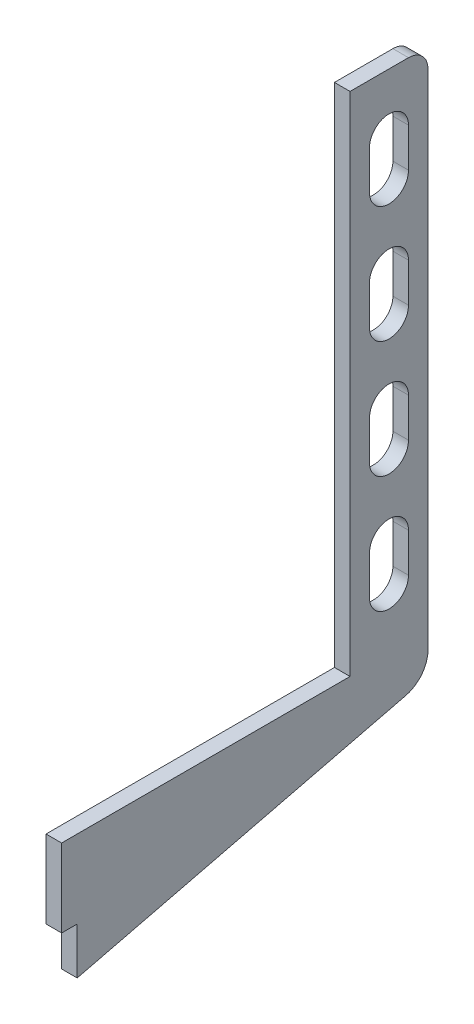
ISO-10303-21;
HEADER;
FILE_DESCRIPTION(('STEP AP214'),'2;1');
FILE_NAME('part.step','',(''),(''),'','','');
FILE_SCHEMA(('AUTOMOTIVE_DESIGN { 1 0 10303 214 1 1 1 1 }'));
ENDSEC;
DATA;
#1=APPLICATION_CONTEXT('core data for automotive mechanical design processes');
#2=APPLICATION_PROTOCOL_DEFINITION('international standard','automotive_design',2000,#1);
#3=PRODUCT_CONTEXT('',#1,'mechanical');
#4=PRODUCT('Part','Part','',(#3));
#5=PRODUCT_RELATED_PRODUCT_CATEGORY('part','',(#4));
#6=PRODUCT_DEFINITION_FORMATION('','',#4);
#7=PRODUCT_DEFINITION_CONTEXT('part definition',#1,'design');
#8=PRODUCT_DEFINITION('design','',#6,#7);
#9=PRODUCT_DEFINITION_SHAPE('','',#8);
#10=(LENGTH_UNIT() NAMED_UNIT(*) SI_UNIT(.MILLI.,.METRE.));
#11=(NAMED_UNIT(*) PLANE_ANGLE_UNIT() SI_UNIT($,.RADIAN.));
#12=(NAMED_UNIT(*) SI_UNIT($,.STERADIAN.) SOLID_ANGLE_UNIT());
#13=UNCERTAINTY_MEASURE_WITH_UNIT(LENGTH_MEASURE(1.E-05),#10,'distance_accuracy_value','');
#14=(GEOMETRIC_REPRESENTATION_CONTEXT(3) GLOBAL_UNCERTAINTY_ASSIGNED_CONTEXT((#13)) GLOBAL_UNIT_ASSIGNED_CONTEXT((#10,
#11,#12)) REPRESENTATION_CONTEXT('',''));
#15=CARTESIAN_POINT('',(0.,0.,0.));
#16=DIRECTION('',(0.,0.,1.));
#17=DIRECTION('',(1.,0.,0.));
#18=AXIS2_PLACEMENT_3D('',#15,#16,#17);
#19=CARTESIAN_POINT('',(0.,175.26,-119.38));
#20=DIRECTION('',(1.,0.,0.));
#21=DIRECTION('',(0.,1.,0.));
#22=AXIS2_PLACEMENT_3D('',#19,#20,#21);
#23=PLANE('',#22);
#24=CARTESIAN_POINT('',(0.,342.9,-213.36));
#25=DIRECTION('',(-1.,0.,0.));
#26=DIRECTION('',(0.,-1.,0.));
#27=AXIS2_PLACEMENT_3D('',#24,#25,#26);
#28=CIRCLE('',#27,12.7);
#29=CARTESIAN_POINT('',(0.,342.9,-200.66));
#30=VERTEX_POINT('',#29);
#31=CARTESIAN_POINT('',(0.,342.9,-226.06));
#32=VERTEX_POINT('',#31);
#33=EDGE_CURVE('E403',#30,#32,#28,.T.);
#34=ORIENTED_EDGE('',*,*,#33,.F.);
#35=DIRECTION('',(0.,1.,0.));
#36=VECTOR('',#35,1.);
#37=CARTESIAN_POINT('',(0.,317.5,-200.66));
#38=LINE('',#37,#36);
#39=CARTESIAN_POINT('',(0.,317.5,-200.66));
#40=VERTEX_POINT('',#39);
#41=EDGE_CURVE('E288',#40,#30,#38,.T.);
#42=ORIENTED_EDGE('',*,*,#41,.F.);
#43=CARTESIAN_POINT('',(0.,317.5,-213.36));
#44=DIRECTION('',(-1.,0.,0.));
#45=DIRECTION('',(0.,1.,0.));
#46=AXIS2_PLACEMENT_3D('',#43,#44,#45);
#47=CIRCLE('',#46,12.7);
#48=CARTESIAN_POINT('',(0.,317.5,-226.06));
#49=VERTEX_POINT('',#48);
#50=EDGE_CURVE('E459',#49,#40,#47,.T.);
#51=ORIENTED_EDGE('',*,*,#50,.F.);
#52=DIRECTION('',(0.,-1.,0.));
#53=VECTOR('',#52,1.);
#54=CARTESIAN_POINT('',(0.,342.9,-226.06));
#55=LINE('',#54,#53);
#56=EDGE_CURVE('E323',#32,#49,#55,.T.);
#57=ORIENTED_EDGE('',*,*,#56,.F.);
#58=EDGE_LOOP('',(#34,#42,#51,#57));
#59=FACE_BOUND('',#58,.T.);
#60=CARTESIAN_POINT('',(0.,266.7,-213.36));
#61=DIRECTION('',(-1.,0.,0.));
#62=DIRECTION('',(0.,-1.,0.));
#63=AXIS2_PLACEMENT_3D('',#60,#61,#62);
#64=CIRCLE('',#63,12.7);
#65=CARTESIAN_POINT('',(0.,266.7,-200.66));
#66=VERTEX_POINT('',#65);
#67=CARTESIAN_POINT('',(0.,266.7,-226.06));
#68=VERTEX_POINT('',#67);
#69=EDGE_CURVE('E330',#66,#68,#64,.T.);
#70=ORIENTED_EDGE('',*,*,#69,.F.);
#71=DIRECTION('',(0.,1.,0.));
#72=VECTOR('',#71,1.);
#73=CARTESIAN_POINT('',(0.,241.3,-200.66));
#74=LINE('',#73,#72);
#75=CARTESIAN_POINT('',(0.,241.3,-200.66));
#76=VERTEX_POINT('',#75);
#77=EDGE_CURVE('E273',#76,#66,#74,.T.);
#78=ORIENTED_EDGE('',*,*,#77,.F.);
#79=CARTESIAN_POINT('',(0.,241.3,-213.36));
#80=DIRECTION('',(-1.,0.,0.));
#81=DIRECTION('',(0.,1.,0.));
#82=AXIS2_PLACEMENT_3D('',#79,#80,#81);
#83=CIRCLE('',#82,12.7);
#84=CARTESIAN_POINT('',(0.,241.3,-226.06));
#85=VERTEX_POINT('',#84);
#86=EDGE_CURVE('E214',#85,#76,#83,.T.);
#87=ORIENTED_EDGE('',*,*,#86,.F.);
#88=DIRECTION('',(0.,-1.,0.));
#89=VECTOR('',#88,1.);
#90=CARTESIAN_POINT('',(0.,266.7,-226.06));
#91=LINE('',#90,#89);
#92=EDGE_CURVE('E380',#68,#85,#91,.T.);
#93=ORIENTED_EDGE('',*,*,#92,.F.);
#94=EDGE_LOOP('',(#70,#78,#87,#93));
#95=FACE_BOUND('',#94,.T.);
#96=CARTESIAN_POINT('',(0.,190.5,-213.36));
#97=DIRECTION('',(-1.,0.,0.));
#98=DIRECTION('',(0.,-1.,0.));
#99=AXIS2_PLACEMENT_3D('',#96,#97,#98);
#100=CIRCLE('',#99,12.7);
#101=CARTESIAN_POINT('',(0.,190.5,-200.66));
#102=VERTEX_POINT('',#101);
#103=CARTESIAN_POINT('',(0.,190.5,-226.06));
#104=VERTEX_POINT('',#103);
#105=EDGE_CURVE('E325',#102,#104,#100,.T.);
#106=ORIENTED_EDGE('',*,*,#105,.F.);
#107=DIRECTION('',(0.,1.,0.));
#108=VECTOR('',#107,1.);
#109=CARTESIAN_POINT('',(0.,165.1,-200.66));
#110=LINE('',#109,#108);
#111=CARTESIAN_POINT('',(0.,165.1,-200.66));
#112=VERTEX_POINT('',#111);
#113=EDGE_CURVE('E381',#112,#102,#110,.T.);
#114=ORIENTED_EDGE('',*,*,#113,.F.);
#115=CARTESIAN_POINT('',(0.,165.1,-213.36));
#116=DIRECTION('',(-1.,0.,0.));
#117=DIRECTION('',(0.,1.,0.));
#118=AXIS2_PLACEMENT_3D('',#115,#116,#117);
#119=CIRCLE('',#118,12.7);
#120=CARTESIAN_POINT('',(0.,165.1,-226.06));
#121=VERTEX_POINT('',#120);
#122=EDGE_CURVE('E299',#121,#112,#119,.T.);
#123=ORIENTED_EDGE('',*,*,#122,.F.);
#124=DIRECTION('',(0.,-1.,0.));
#125=VECTOR('',#124,1.);
#126=CARTESIAN_POINT('',(0.,190.5,-226.06));
#127=LINE('',#126,#125);
#128=EDGE_CURVE('E352',#104,#121,#127,.T.);
#129=ORIENTED_EDGE('',*,*,#128,.F.);
#130=EDGE_LOOP('',(#106,#114,#123,#129));
#131=FACE_BOUND('',#130,.T.);
#132=CARTESIAN_POINT('',(0.,114.3,-213.36));
#133=DIRECTION('',(-1.,0.,0.));
#134=DIRECTION('',(0.,-1.,0.));
#135=AXIS2_PLACEMENT_3D('',#132,#133,#134);
#136=CIRCLE('',#135,12.7);
#137=CARTESIAN_POINT('',(0.,114.3,-200.66));
#138=VERTEX_POINT('',#137);
#139=CARTESIAN_POINT('',(0.,114.3,-226.06));
#140=VERTEX_POINT('',#139);
#141=EDGE_CURVE('E347',#138,#140,#136,.T.);
#142=ORIENTED_EDGE('',*,*,#141,.F.);
#143=DIRECTION('',(0.,1.,0.));
#144=VECTOR('',#143,1.);
#145=CARTESIAN_POINT('',(0.,88.9,-200.66));
#146=LINE('',#145,#144);
#147=CARTESIAN_POINT('',(0.,88.9,-200.66));
#148=VERTEX_POINT('',#147);
#149=EDGE_CURVE('E430',#148,#138,#146,.T.);
#150=ORIENTED_EDGE('',*,*,#149,.F.);
#151=CARTESIAN_POINT('',(0.,88.9,-213.36));
#152=DIRECTION('',(-1.,0.,0.));
#153=DIRECTION('',(0.,1.,0.));
#154=AXIS2_PLACEMENT_3D('',#151,#152,#153);
#155=CIRCLE('',#154,12.7);
#156=CARTESIAN_POINT('',(0.,88.9,-226.06));
#157=VERTEX_POINT('',#156);
#158=EDGE_CURVE('E369',#157,#148,#155,.T.);
#159=ORIENTED_EDGE('',*,*,#158,.F.);
#160=DIRECTION('',(0.,-1.,0.));
#161=VECTOR('',#160,1.);
#162=CARTESIAN_POINT('',(0.,114.3,-226.06));
#163=LINE('',#162,#161);
#164=EDGE_CURVE('E406',#140,#157,#163,.T.);
#165=ORIENTED_EDGE('',*,*,#164,.F.);
#166=EDGE_LOOP('',(#142,#150,#159,#165));
#167=FACE_BOUND('',#166,.T.);
#168=DIRECTION('',(0.,-1.,0.));
#169=VECTOR('',#168,1.);
#170=CARTESIAN_POINT('',(0.,0.,-10.16));
#171=LINE('',#170,#169);
#172=CARTESIAN_POINT('',(0.,0.,-10.16));
#173=VERTEX_POINT('',#172);
#174=CARTESIAN_POINT('',(0.,-30.48,-10.16));
#175=VERTEX_POINT('',#174);
#176=EDGE_CURVE('E27',#173,#175,#171,.T.);
#177=ORIENTED_EDGE('',*,*,#176,.F.);
#178=DIRECTION('',(0.,0.,-1.));
#179=VECTOR('',#178,1.);
#180=CARTESIAN_POINT('',(0.,0.,0.));
#181=LINE('',#180,#179);
#182=CARTESIAN_POINT('',(0.,0.,0.));
#183=VERTEX_POINT('',#182);
#184=EDGE_CURVE('E317',#183,#173,#181,.T.);
#185=ORIENTED_EDGE('',*,*,#184,.F.);
#186=DIRECTION('',(0.,-1.,0.));
#187=VECTOR('',#186,1.);
#188=CARTESIAN_POINT('',(0.,50.8,0.));
#189=LINE('',#188,#187);
#190=CARTESIAN_POINT('',(0.,50.8,0.));
#191=VERTEX_POINT('',#190);
#192=EDGE_CURVE('E339',#191,#183,#189,.T.);
#193=ORIENTED_EDGE('',*,*,#192,.F.);
#194=DIRECTION('',(0.,0.,1.));
#195=VECTOR('',#194,1.);
#196=CARTESIAN_POINT('',(0.,50.8,-187.96));
#197=LINE('',#196,#195);
#198=CARTESIAN_POINT('',(0.,50.8,-187.96));
#199=VERTEX_POINT('',#198);
#200=EDGE_CURVE('E446',#199,#191,#197,.T.);
#201=ORIENTED_EDGE('',*,*,#200,.F.);
#202=DIRECTION('',(0.,-1.,0.));
#203=VECTOR('',#202,1.);
#204=CARTESIAN_POINT('',(0.,381.,-187.96));
#205=LINE('',#204,#203);
#206=CARTESIAN_POINT('',(0.,381.,-187.96));
#207=VERTEX_POINT('',#206);
#208=EDGE_CURVE('E304',#207,#199,#205,.T.);
#209=ORIENTED_EDGE('',*,*,#208,.F.);
#210=DIRECTION('',(0.,0.,1.));
#211=VECTOR('',#210,1.);
#212=CARTESIAN_POINT('',(0.,381.,-226.06));
#213=LINE('',#212,#211);
#214=CARTESIAN_POINT('',(0.,381.,-226.06));
#215=VERTEX_POINT('',#214);
#216=EDGE_CURVE('E20',#215,#207,#213,.T.);
#217=ORIENTED_EDGE('',*,*,#216,.F.);
#218=CARTESIAN_POINT('',(0.,368.3,-226.06));
#219=DIRECTION('',(1.,0.,0.));
#220=DIRECTION('',(0.,0.,-1.));
#221=AXIS2_PLACEMENT_3D('',#218,#219,#220);
#222=CIRCLE('',#221,12.7);
#223=CARTESIAN_POINT('',(0.,368.3,-238.76));
#224=VERTEX_POINT('',#223);
#225=EDGE_CURVE('E284',#224,#215,#222,.T.);
#226=ORIENTED_EDGE('',*,*,#225,.F.);
#227=DIRECTION('',(0.,1.,0.));
#228=VECTOR('',#227,1.);
#229=CARTESIAN_POINT('',(0.,40.3542242984182,-238.76));
#230=LINE('',#229,#228);
#231=CARTESIAN_POINT('',(0.,40.3542242984182,-238.76));
#232=VERTEX_POINT('',#231);
#233=EDGE_CURVE('E441',#232,#224,#230,.T.);
#234=ORIENTED_EDGE('',*,*,#233,.F.);
#235=CARTESIAN_POINT('',(0.,40.3542242984182,-219.71));
#236=DIRECTION('',(1.,0.,0.));
#237=DIRECTION('',(0.,-0.971399006496777,-0.237453090476993));
#238=AXIS2_PLACEMENT_3D('',#235,#236,#237);
#239=CIRCLE('',#238,19.05);
#240=CARTESIAN_POINT('',(0.,21.8490732246545,-224.233481373586));
#241=VERTEX_POINT('',#240);
#242=EDGE_CURVE('E357',#241,#232,#239,.T.);
#243=ORIENTED_EDGE('',*,*,#242,.F.);
#244=DIRECTION('',(0.,0.23745309047699,-0.971399006496777));
#245=VECTOR('',#244,1.);
#246=CARTESIAN_POINT('',(0.,-30.48,-10.16));
#247=LINE('',#246,#245);
#248=EDGE_CURVE('E400',#175,#241,#247,.T.);
#249=ORIENTED_EDGE('',*,*,#248,.F.);
#250=EDGE_LOOP('',(#177,#185,#193,#201,#209,#217,#226,#234,#243,#249));
#251=FACE_BOUND('',#250,.T.);
#252=ADVANCED_FACE('F16',(#59,#95,#131,#167,#251),#23,.F.);
#253=CARTESIAN_POINT('',(10.16,175.26,-119.38));
#254=DIRECTION('',(1.,0.,0.));
#255=DIRECTION('',(0.,1.,0.));
#256=AXIS2_PLACEMENT_3D('',#253,#254,#255);
#257=PLANE('',#256);
#258=CARTESIAN_POINT('',(10.16,342.9,-213.36));
#259=DIRECTION('',(-1.,0.,0.));
#260=DIRECTION('',(0.,-1.,0.));
#261=AXIS2_PLACEMENT_3D('',#258,#259,#260);
#262=CIRCLE('',#261,12.7);
#263=CARTESIAN_POINT('',(10.16,342.9,-200.66));
#264=VERTEX_POINT('',#263);
#265=CARTESIAN_POINT('',(10.16,342.9,-226.06));
#266=VERTEX_POINT('',#265);
#267=EDGE_CURVE('E225',#264,#266,#262,.T.);
#268=ORIENTED_EDGE('',*,*,#267,.T.);
#269=DIRECTION('',(0.,-1.,0.));
#270=VECTOR('',#269,1.);
#271=CARTESIAN_POINT('',(10.16,342.9,-226.06));
#272=LINE('',#271,#270);
#273=CARTESIAN_POINT('',(10.16,317.5,-226.06));
#274=VERTEX_POINT('',#273);
#275=EDGE_CURVE('E364',#266,#274,#272,.T.);
#276=ORIENTED_EDGE('',*,*,#275,.T.);
#277=CARTESIAN_POINT('',(10.16,317.5,-213.36));
#278=DIRECTION('',(-1.,0.,0.));
#279=DIRECTION('',(0.,1.,0.));
#280=AXIS2_PLACEMENT_3D('',#277,#278,#279);
#281=CIRCLE('',#280,12.7);
#282=CARTESIAN_POINT('',(10.16,317.5,-200.66));
#283=VERTEX_POINT('',#282);
#284=EDGE_CURVE('E324',#274,#283,#281,.T.);
#285=ORIENTED_EDGE('',*,*,#284,.T.);
#286=DIRECTION('',(0.,1.,0.));
#287=VECTOR('',#286,1.);
#288=CARTESIAN_POINT('',(10.16,317.5,-200.66));
#289=LINE('',#288,#287);
#290=EDGE_CURVE('E343',#283,#264,#289,.T.);
#291=ORIENTED_EDGE('',*,*,#290,.T.);
#292=EDGE_LOOP('',(#268,#276,#285,#291));
#293=FACE_BOUND('',#292,.T.);
#294=CARTESIAN_POINT('',(10.16,266.7,-213.36));
#295=DIRECTION('',(-1.,0.,0.));
#296=DIRECTION('',(0.,-1.,0.));
#297=AXIS2_PLACEMENT_3D('',#294,#295,#296);
#298=CIRCLE('',#297,12.7);
#299=CARTESIAN_POINT('',(10.16,266.7,-200.66));
#300=VERTEX_POINT('',#299);
#301=CARTESIAN_POINT('',(10.16,266.7,-226.06));
#302=VERTEX_POINT('',#301);
#303=EDGE_CURVE('E333',#300,#302,#298,.T.);
#304=ORIENTED_EDGE('',*,*,#303,.T.);
#305=DIRECTION('',(0.,-1.,0.));
#306=VECTOR('',#305,1.);
#307=CARTESIAN_POINT('',(10.16,266.7,-226.06));
#308=LINE('',#307,#306);
#309=CARTESIAN_POINT('',(10.16,241.3,-226.06));
#310=VERTEX_POINT('',#309);
#311=EDGE_CURVE('E252',#302,#310,#308,.T.);
#312=ORIENTED_EDGE('',*,*,#311,.T.);
#313=CARTESIAN_POINT('',(10.16,241.3,-213.36));
#314=DIRECTION('',(-1.,0.,0.));
#315=DIRECTION('',(0.,1.,0.));
#316=AXIS2_PLACEMENT_3D('',#313,#314,#315);
#317=CIRCLE('',#316,12.7);
#318=CARTESIAN_POINT('',(10.16,241.3,-200.66));
#319=VERTEX_POINT('',#318);
#320=EDGE_CURVE('E245',#310,#319,#317,.T.);
#321=ORIENTED_EDGE('',*,*,#320,.T.);
#322=DIRECTION('',(0.,1.,0.));
#323=VECTOR('',#322,1.);
#324=CARTESIAN_POINT('',(10.16,241.3,-200.66));
#325=LINE('',#324,#323);
#326=EDGE_CURVE('E249',#319,#300,#325,.T.);
#327=ORIENTED_EDGE('',*,*,#326,.T.);
#328=EDGE_LOOP('',(#304,#312,#321,#327));
#329=FACE_BOUND('',#328,.T.);
#330=CARTESIAN_POINT('',(10.16,190.5,-213.36));
#331=DIRECTION('',(-1.,0.,0.));
#332=DIRECTION('',(0.,-1.,0.));
#333=AXIS2_PLACEMENT_3D('',#330,#331,#332);
#334=CIRCLE('',#333,12.7);
#335=CARTESIAN_POINT('',(10.16,190.5,-200.66));
#336=VERTEX_POINT('',#335);
#337=CARTESIAN_POINT('',(10.16,190.5,-226.06));
#338=VERTEX_POINT('',#337);
#339=EDGE_CURVE('E327',#336,#338,#334,.T.);
#340=ORIENTED_EDGE('',*,*,#339,.T.);
#341=DIRECTION('',(0.,-1.,0.));
#342=VECTOR('',#341,1.);
#343=CARTESIAN_POINT('',(10.16,190.5,-226.06));
#344=LINE('',#343,#342);
#345=CARTESIAN_POINT('',(10.16,165.1,-226.06));
#346=VERTEX_POINT('',#345);
#347=EDGE_CURVE('E368',#338,#346,#344,.T.);
#348=ORIENTED_EDGE('',*,*,#347,.T.);
#349=CARTESIAN_POINT('',(10.16,165.1,-213.36));
#350=DIRECTION('',(-1.,0.,0.));
#351=DIRECTION('',(0.,1.,0.));
#352=AXIS2_PLACEMENT_3D('',#349,#350,#351);
#353=CIRCLE('',#352,12.7);
#354=CARTESIAN_POINT('',(10.16,165.1,-200.66));
#355=VERTEX_POINT('',#354);
#356=EDGE_CURVE('E302',#346,#355,#353,.T.);
#357=ORIENTED_EDGE('',*,*,#356,.T.);
#358=DIRECTION('',(0.,1.,0.));
#359=VECTOR('',#358,1.);
#360=CARTESIAN_POINT('',(10.16,165.1,-200.66));
#361=LINE('',#360,#359);
#362=EDGE_CURVE('E418',#355,#336,#361,.T.);
#363=ORIENTED_EDGE('',*,*,#362,.T.);
#364=EDGE_LOOP('',(#340,#348,#357,#363));
#365=FACE_BOUND('',#364,.T.);
#366=CARTESIAN_POINT('',(10.16,114.3,-213.36));
#367=DIRECTION('',(-1.,0.,0.));
#368=DIRECTION('',(0.,-1.,0.));
#369=AXIS2_PLACEMENT_3D('',#366,#367,#368);
#370=CIRCLE('',#369,12.7);
#371=CARTESIAN_POINT('',(10.16,114.3,-200.66));
#372=VERTEX_POINT('',#371);
#373=CARTESIAN_POINT('',(10.16,114.3,-226.06));
#374=VERTEX_POINT('',#373);
#375=EDGE_CURVE('E344',#372,#374,#370,.T.);
#376=ORIENTED_EDGE('',*,*,#375,.T.);
#377=DIRECTION('',(0.,-1.,0.));
#378=VECTOR('',#377,1.);
#379=CARTESIAN_POINT('',(10.16,114.3,-226.06));
#380=LINE('',#379,#378);
#381=CARTESIAN_POINT('',(10.16,88.9,-226.06));
#382=VERTEX_POINT('',#381);
#383=EDGE_CURVE('E409',#374,#382,#380,.T.);
#384=ORIENTED_EDGE('',*,*,#383,.T.);
#385=CARTESIAN_POINT('',(10.16,88.9,-213.36));
#386=DIRECTION('',(-1.,0.,0.));
#387=DIRECTION('',(0.,1.,0.));
#388=AXIS2_PLACEMENT_3D('',#385,#386,#387);
#389=CIRCLE('',#388,12.7);
#390=CARTESIAN_POINT('',(10.16,88.9,-200.66));
#391=VERTEX_POINT('',#390);
#392=EDGE_CURVE('E372',#382,#391,#389,.T.);
#393=ORIENTED_EDGE('',*,*,#392,.T.);
#394=DIRECTION('',(0.,1.,0.));
#395=VECTOR('',#394,1.);
#396=CARTESIAN_POINT('',(10.16,88.9,-200.66));
#397=LINE('',#396,#395);
#398=EDGE_CURVE('E293',#391,#372,#397,.T.);
#399=ORIENTED_EDGE('',*,*,#398,.T.);
#400=EDGE_LOOP('',(#376,#384,#393,#399));
#401=FACE_BOUND('',#400,.T.);
#402=DIRECTION('',(0.,-1.,0.));
#403=VECTOR('',#402,1.);
#404=CARTESIAN_POINT('',(10.16,0.,-10.16));
#405=LINE('',#404,#403);
#406=CARTESIAN_POINT('',(10.16,0.,-10.16));
#407=VERTEX_POINT('',#406);
#408=CARTESIAN_POINT('',(10.16,-30.48,-10.16));
#409=VERTEX_POINT('',#408);
#410=EDGE_CURVE('E10',#407,#409,#405,.T.);
#411=ORIENTED_EDGE('',*,*,#410,.T.);
#412=DIRECTION('',(0.,0.23745309047699,-0.971399006496777));
#413=VECTOR('',#412,1.);
#414=CARTESIAN_POINT('',(10.16,-30.48,-10.16));
#415=LINE('',#414,#413);
#416=CARTESIAN_POINT('',(10.16,21.8490732246545,-224.233481373586));
#417=VERTEX_POINT('',#416);
#418=EDGE_CURVE('E312',#409,#417,#415,.T.);
#419=ORIENTED_EDGE('',*,*,#418,.T.);
#420=CARTESIAN_POINT('',(10.16,40.3542242984182,-219.71));
#421=DIRECTION('',(1.,0.,0.));
#422=DIRECTION('',(0.,-0.971399006496777,-0.237453090476993));
#423=AXIS2_PLACEMENT_3D('',#420,#421,#422);
#424=CIRCLE('',#423,19.05);
#425=CARTESIAN_POINT('',(10.16,40.3542242984182,-238.76));
#426=VERTEX_POINT('',#425);
#427=EDGE_CURVE('E277',#417,#426,#424,.T.);
#428=ORIENTED_EDGE('',*,*,#427,.T.);
#429=DIRECTION('',(0.,1.,0.));
#430=VECTOR('',#429,1.);
#431=CARTESIAN_POINT('',(10.16,40.3542242984182,-238.76));
#432=LINE('',#431,#430);
#433=CARTESIAN_POINT('',(10.16,368.3,-238.76));
#434=VERTEX_POINT('',#433);
#435=EDGE_CURVE('E358',#426,#434,#432,.T.);
#436=ORIENTED_EDGE('',*,*,#435,.T.);
#437=CARTESIAN_POINT('',(10.16,368.3,-226.06));
#438=DIRECTION('',(1.,0.,0.));
#439=DIRECTION('',(0.,0.,-1.));
#440=AXIS2_PLACEMENT_3D('',#437,#438,#439);
#441=CIRCLE('',#440,12.7);
#442=CARTESIAN_POINT('',(10.16,381.,-226.06));
#443=VERTEX_POINT('',#442);
#444=EDGE_CURVE('E279',#434,#443,#441,.T.);
#445=ORIENTED_EDGE('',*,*,#444,.T.);
#446=DIRECTION('',(0.,0.,1.));
#447=VECTOR('',#446,1.);
#448=CARTESIAN_POINT('',(10.16,381.,-226.06));
#449=LINE('',#448,#447);
#450=CARTESIAN_POINT('',(10.16,381.,-187.96));
#451=VERTEX_POINT('',#450);
#452=EDGE_CURVE('E388',#443,#451,#449,.T.);
#453=ORIENTED_EDGE('',*,*,#452,.T.);
#454=DIRECTION('',(0.,-1.,0.));
#455=VECTOR('',#454,1.);
#456=CARTESIAN_POINT('',(10.16,381.,-187.96));
#457=LINE('',#456,#455);
#458=CARTESIAN_POINT('',(10.16,50.8,-187.96));
#459=VERTEX_POINT('',#458);
#460=EDGE_CURVE('E307',#451,#459,#457,.T.);
#461=ORIENTED_EDGE('',*,*,#460,.T.);
#462=DIRECTION('',(0.,0.,1.));
#463=VECTOR('',#462,1.);
#464=CARTESIAN_POINT('',(10.16,50.8,-187.96));
#465=LINE('',#464,#463);
#466=CARTESIAN_POINT('',(10.16,50.8,0.));
#467=VERTEX_POINT('',#466);
#468=EDGE_CURVE('E449',#459,#467,#465,.T.);
#469=ORIENTED_EDGE('',*,*,#468,.T.);
#470=DIRECTION('',(0.,-1.,0.));
#471=VECTOR('',#470,1.);
#472=CARTESIAN_POINT('',(10.16,50.8,0.));
#473=LINE('',#472,#471);
#474=CARTESIAN_POINT('',(10.16,0.,0.));
#475=VERTEX_POINT('',#474);
#476=EDGE_CURVE('E335',#467,#475,#473,.T.);
#477=ORIENTED_EDGE('',*,*,#476,.T.);
#478=DIRECTION('',(0.,0.,-1.));
#479=VECTOR('',#478,1.);
#480=CARTESIAN_POINT('',(10.16,0.,0.));
#481=LINE('',#480,#479);
#482=EDGE_CURVE('E316',#475,#407,#481,.T.);
#483=ORIENTED_EDGE('',*,*,#482,.T.);
#484=EDGE_LOOP('',(#411,#419,#428,#436,#445,#453,#461,#469,#477,#483));
#485=FACE_BOUND('',#484,.T.);
#486=ADVANCED_FACE('F246',(#293,#329,#365,#401,#485),#257,.T.);
#487=CARTESIAN_POINT('',(0.,0.,-10.16));
#488=DIRECTION('',(0.,0.,1.));
#489=DIRECTION('',(1.,0.,0.));
#490=AXIS2_PLACEMENT_3D('',#487,#488,#489);
#491=PLANE('',#490);
#492=ORIENTED_EDGE('',*,*,#176,.T.);
#493=DIRECTION('',(1.,0.,0.));
#494=VECTOR('',#493,1.);
#495=CARTESIAN_POINT('',(0.,-30.48,-10.16));
#496=LINE('',#495,#494);
#497=EDGE_CURVE('E309',#175,#409,#496,.T.);
#498=ORIENTED_EDGE('',*,*,#497,.T.);
#499=ORIENTED_EDGE('',*,*,#410,.F.);
#500=DIRECTION('',(1.,0.,0.));
#501=VECTOR('',#500,1.);
#502=CARTESIAN_POINT('',(0.,0.,-10.16));
#503=LINE('',#502,#501);
#504=EDGE_CURVE('E313',#173,#407,#503,.T.);
#505=ORIENTED_EDGE('',*,*,#504,.F.);
#506=EDGE_LOOP('',(#492,#498,#499,#505));
#507=FACE_BOUND('',#506,.T.);
#508=ADVANCED_FACE('F555',(#507),#491,.T.);
#509=CARTESIAN_POINT('',(0.,-30.48,-10.16));
#510=DIRECTION('',(0.,-0.971399006496778,-0.23745309047699));
#511=DIRECTION('',(0.,0.23745309047699,-0.971399006496778));
#512=AXIS2_PLACEMENT_3D('',#509,#510,#511);
#513=PLANE('',#512);
#514=ORIENTED_EDGE('',*,*,#248,.T.);
#515=DIRECTION('',(1.,0.,0.));
#516=VECTOR('',#515,1.);
#517=CARTESIAN_POINT('',(0.,21.8490732246545,-224.233481373586));
#518=LINE('',#517,#516);
#519=EDGE_CURVE('E396',#241,#417,#518,.T.);
#520=ORIENTED_EDGE('',*,*,#519,.T.);
#521=ORIENTED_EDGE('',*,*,#418,.F.);
#522=ORIENTED_EDGE('',*,*,#497,.F.);
#523=EDGE_LOOP('',(#514,#520,#521,#522));
#524=FACE_BOUND('',#523,.T.);
#525=ADVANCED_FACE('F869',(#524),#513,.T.);
#526=CARTESIAN_POINT('',(0.,40.3542242984182,-219.71));
#527=DIRECTION('',(1.,0.,0.));
#528=DIRECTION('',(0.,-0.971399006496777,-0.237453090476993));
#529=AXIS2_PLACEMENT_3D('',#526,#527,#528);
#530=CYLINDRICAL_SURFACE('',#529,19.05);
#531=ORIENTED_EDGE('',*,*,#242,.T.);
#532=DIRECTION('',(1.,0.,0.));
#533=VECTOR('',#532,1.);
#534=CARTESIAN_POINT('',(0.,40.3542242984182,-238.76));
#535=LINE('',#534,#533);
#536=EDGE_CURVE('E353',#232,#426,#535,.T.);
#537=ORIENTED_EDGE('',*,*,#536,.T.);
#538=ORIENTED_EDGE('',*,*,#427,.F.);
#539=ORIENTED_EDGE('',*,*,#519,.F.);
#540=EDGE_LOOP('',(#531,#537,#538,#539));
#541=FACE_BOUND('',#540,.T.);
#542=ADVANCED_FACE('F874',(#541),#530,.T.);
#543=CARTESIAN_POINT('',(0.,40.3542242984182,-238.76));
#544=DIRECTION('',(0.,0.,-1.));
#545=DIRECTION('',(-1.,0.,0.));
#546=AXIS2_PLACEMENT_3D('',#543,#544,#545);
#547=PLANE('',#546);
#548=ORIENTED_EDGE('',*,*,#233,.T.);
#549=DIRECTION('',(1.,0.,0.));
#550=VECTOR('',#549,1.);
#551=CARTESIAN_POINT('',(0.,368.3,-238.76));
#552=LINE('',#551,#550);
#553=EDGE_CURVE('E283',#224,#434,#552,.T.);
#554=ORIENTED_EDGE('',*,*,#553,.T.);
#555=ORIENTED_EDGE('',*,*,#435,.F.);
#556=ORIENTED_EDGE('',*,*,#536,.F.);
#557=EDGE_LOOP('',(#548,#554,#555,#556));
#558=FACE_BOUND('',#557,.T.);
#559=ADVANCED_FACE('F816',(#558),#547,.T.);
#560=CARTESIAN_POINT('',(0.,368.3,-226.06));
#561=DIRECTION('',(1.,0.,0.));
#562=DIRECTION('',(0.,0.,-1.));
#563=AXIS2_PLACEMENT_3D('',#560,#561,#562);
#564=CYLINDRICAL_SURFACE('',#563,12.7);
#565=ORIENTED_EDGE('',*,*,#225,.T.);
#566=DIRECTION('',(1.,0.,0.));
#567=VECTOR('',#566,1.);
#568=CARTESIAN_POINT('',(0.,381.,-226.06));
#569=LINE('',#568,#567);
#570=EDGE_CURVE('E287',#215,#443,#569,.T.);
#571=ORIENTED_EDGE('',*,*,#570,.T.);
#572=ORIENTED_EDGE('',*,*,#444,.F.);
#573=ORIENTED_EDGE('',*,*,#553,.F.);
#574=EDGE_LOOP('',(#565,#571,#572,#573));
#575=FACE_BOUND('',#574,.T.);
#576=ADVANCED_FACE('F819',(#575),#564,.T.);
#577=CARTESIAN_POINT('',(0.,381.,-226.06));
#578=DIRECTION('',(0.,1.,0.));
#579=DIRECTION('',(1.,0.,0.));
#580=AXIS2_PLACEMENT_3D('',#577,#578,#579);
#581=PLANE('',#580);
#582=ORIENTED_EDGE('',*,*,#216,.T.);
#583=DIRECTION('',(1.,0.,0.));
#584=VECTOR('',#583,1.);
#585=CARTESIAN_POINT('',(0.,381.,-187.96));
#586=LINE('',#585,#584);
#587=EDGE_CURVE('E434',#207,#451,#586,.T.);
#588=ORIENTED_EDGE('',*,*,#587,.T.);
#589=ORIENTED_EDGE('',*,*,#452,.F.);
#590=ORIENTED_EDGE('',*,*,#570,.F.);
#591=EDGE_LOOP('',(#582,#588,#589,#590));
#592=FACE_BOUND('',#591,.T.);
#593=ADVANCED_FACE('F577',(#592),#581,.T.);
#594=CARTESIAN_POINT('',(0.,381.,-187.96));
#595=DIRECTION('',(0.,0.,1.));
#596=DIRECTION('',(0.,-1.,0.));
#597=AXIS2_PLACEMENT_3D('',#594,#595,#596);
#598=PLANE('',#597);
#599=ORIENTED_EDGE('',*,*,#208,.T.);
#600=DIRECTION('',(1.,0.,0.));
#601=VECTOR('',#600,1.);
#602=CARTESIAN_POINT('',(0.,50.8,-187.96));
#603=LINE('',#602,#601);
#604=EDGE_CURVE('E308',#199,#459,#603,.T.);
#605=ORIENTED_EDGE('',*,*,#604,.T.);
#606=ORIENTED_EDGE('',*,*,#460,.F.);
#607=ORIENTED_EDGE('',*,*,#587,.F.);
#608=EDGE_LOOP('',(#599,#605,#606,#607));
#609=FACE_BOUND('',#608,.T.);
#610=ADVANCED_FACE('F573',(#609),#598,.T.);
#611=CARTESIAN_POINT('',(0.,50.8,-187.96));
#612=DIRECTION('',(0.,1.,0.));
#613=DIRECTION('',(1.,0.,0.));
#614=AXIS2_PLACEMENT_3D('',#611,#612,#613);
#615=PLANE('',#614);
#616=ORIENTED_EDGE('',*,*,#200,.T.);
#617=DIRECTION('',(1.,0.,0.));
#618=VECTOR('',#617,1.);
#619=CARTESIAN_POINT('',(0.,50.8,0.));
#620=LINE('',#619,#618);
#621=EDGE_CURVE('E338',#191,#467,#620,.T.);
#622=ORIENTED_EDGE('',*,*,#621,.T.);
#623=ORIENTED_EDGE('',*,*,#468,.F.);
#624=ORIENTED_EDGE('',*,*,#604,.F.);
#625=EDGE_LOOP('',(#616,#622,#623,#624));
#626=FACE_BOUND('',#625,.T.);
#627=ADVANCED_FACE('F569',(#626),#615,.T.);
#628=CARTESIAN_POINT('',(0.,50.8,0.));
#629=DIRECTION('',(0.,0.,1.));
#630=DIRECTION('',(1.,0.,0.));
#631=AXIS2_PLACEMENT_3D('',#628,#629,#630);
#632=PLANE('',#631);
#633=ORIENTED_EDGE('',*,*,#192,.T.);
#634=DIRECTION('',(1.,0.,0.));
#635=VECTOR('',#634,1.);
#636=CARTESIAN_POINT('',(0.,0.,0.));
#637=LINE('',#636,#635);
#638=EDGE_CURVE('E361',#183,#475,#637,.T.);
#639=ORIENTED_EDGE('',*,*,#638,.T.);
#640=ORIENTED_EDGE('',*,*,#476,.F.);
#641=ORIENTED_EDGE('',*,*,#621,.F.);
#642=EDGE_LOOP('',(#633,#639,#640,#641));
#643=FACE_BOUND('',#642,.T.);
#644=ADVANCED_FACE('F562',(#643),#632,.T.);
#645=CARTESIAN_POINT('',(0.,0.,0.));
#646=DIRECTION('',(0.,-1.,0.));
#647=DIRECTION('',(0.,0.,-1.));
#648=AXIS2_PLACEMENT_3D('',#645,#646,#647);
#649=PLANE('',#648);
#650=ORIENTED_EDGE('',*,*,#184,.T.);
#651=ORIENTED_EDGE('',*,*,#504,.T.);
#652=ORIENTED_EDGE('',*,*,#482,.F.);
#653=ORIENTED_EDGE('',*,*,#638,.F.);
#654=EDGE_LOOP('',(#650,#651,#652,#653));
#655=FACE_BOUND('',#654,.T.);
#656=ADVANCED_FACE('F559',(#655),#649,.T.);
#657=CARTESIAN_POINT('',(0.,114.3,-213.36));
#658=DIRECTION('',(1.,0.,0.));
#659=DIRECTION('',(0.,1.,0.));
#660=AXIS2_PLACEMENT_3D('',#657,#658,#659);
#661=CYLINDRICAL_SURFACE('',#660,12.7);
#662=ORIENTED_EDGE('',*,*,#141,.T.);
#663=DIRECTION('',(1.,0.,0.));
#664=VECTOR('',#663,1.);
#665=CARTESIAN_POINT('',(0.,114.3,-226.06));
#666=LINE('',#665,#664);
#667=EDGE_CURVE('E377',#140,#374,#666,.T.);
#668=ORIENTED_EDGE('',*,*,#667,.T.);
#669=ORIENTED_EDGE('',*,*,#375,.F.);
#670=DIRECTION('',(1.,0.,0.));
#671=VECTOR('',#670,1.);
#672=CARTESIAN_POINT('',(0.,114.3,-200.66));
#673=LINE('',#672,#671);
#674=EDGE_CURVE('E298',#138,#372,#673,.T.);
#675=ORIENTED_EDGE('',*,*,#674,.F.);
#676=EDGE_LOOP('',(#662,#668,#669,#675));
#677=FACE_BOUND('',#676,.T.);
#678=ADVANCED_FACE('F913',(#677),#661,.F.);
#679=CARTESIAN_POINT('',(0.,114.3,-226.06));
#680=DIRECTION('',(0.,0.,1.));
#681=DIRECTION('',(0.,-1.,0.));
#682=AXIS2_PLACEMENT_3D('',#679,#680,#681);
#683=PLANE('',#682);
#684=ORIENTED_EDGE('',*,*,#164,.T.);
#685=DIRECTION('',(1.,0.,0.));
#686=VECTOR('',#685,1.);
#687=CARTESIAN_POINT('',(0.,88.9,-226.06));
#688=LINE('',#687,#686);
#689=EDGE_CURVE('E410',#157,#382,#688,.T.);
#690=ORIENTED_EDGE('',*,*,#689,.T.);
#691=ORIENTED_EDGE('',*,*,#383,.F.);
#692=ORIENTED_EDGE('',*,*,#667,.F.);
#693=EDGE_LOOP('',(#684,#690,#691,#692));
#694=FACE_BOUND('',#693,.T.);
#695=ADVANCED_FACE('F896',(#694),#683,.T.);
#696=CARTESIAN_POINT('',(0.,88.9,-213.36));
#697=DIRECTION('',(1.,0.,0.));
#698=DIRECTION('',(0.,-1.,0.));
#699=AXIS2_PLACEMENT_3D('',#696,#697,#698);
#700=CYLINDRICAL_SURFACE('',#699,12.7);
#701=ORIENTED_EDGE('',*,*,#158,.T.);
#702=DIRECTION('',(1.,0.,0.));
#703=VECTOR('',#702,1.);
#704=CARTESIAN_POINT('',(0.,88.9,-200.66));
#705=LINE('',#704,#703);
#706=EDGE_CURVE('E297',#148,#391,#705,.T.);
#707=ORIENTED_EDGE('',*,*,#706,.T.);
#708=ORIENTED_EDGE('',*,*,#392,.F.);
#709=ORIENTED_EDGE('',*,*,#689,.F.);
#710=EDGE_LOOP('',(#701,#707,#708,#709));
#711=FACE_BOUND('',#710,.T.);
#712=ADVANCED_FACE('F848',(#711),#700,.F.);
#713=CARTESIAN_POINT('',(0.,88.9,-200.66));
#714=DIRECTION('',(0.,0.,-1.));
#715=DIRECTION('',(0.,-1.,0.));
#716=AXIS2_PLACEMENT_3D('',#713,#714,#715);
#717=PLANE('',#716);
#718=ORIENTED_EDGE('',*,*,#149,.T.);
#719=ORIENTED_EDGE('',*,*,#674,.T.);
#720=ORIENTED_EDGE('',*,*,#398,.F.);
#721=ORIENTED_EDGE('',*,*,#706,.F.);
#722=EDGE_LOOP('',(#718,#719,#720,#721));
#723=FACE_BOUND('',#722,.T.);
#724=ADVANCED_FACE('F842',(#723),#717,.T.);
#725=CARTESIAN_POINT('',(0.,190.5,-213.36));
#726=DIRECTION('',(1.,0.,0.));
#727=DIRECTION('',(0.,1.,0.));
#728=AXIS2_PLACEMENT_3D('',#725,#726,#727);
#729=CYLINDRICAL_SURFACE('',#728,12.7);
#730=ORIENTED_EDGE('',*,*,#105,.T.);
#731=DIRECTION('',(1.,0.,0.));
#732=VECTOR('',#731,1.);
#733=CARTESIAN_POINT('',(0.,190.5,-226.06));
#734=LINE('',#733,#732);
#735=EDGE_CURVE('E328',#104,#338,#734,.T.);
#736=ORIENTED_EDGE('',*,*,#735,.T.);
#737=ORIENTED_EDGE('',*,*,#339,.F.);
#738=DIRECTION('',(1.,0.,0.));
#739=VECTOR('',#738,1.);
#740=CARTESIAN_POINT('',(0.,190.5,-200.66));
#741=LINE('',#740,#739);
#742=EDGE_CURVE('E385',#102,#336,#741,.T.);
#743=ORIENTED_EDGE('',*,*,#742,.F.);
#744=EDGE_LOOP('',(#730,#736,#737,#743));
#745=FACE_BOUND('',#744,.T.);
#746=ADVANCED_FACE('F847',(#745),#729,.F.);
#747=CARTESIAN_POINT('',(0.,190.5,-226.06));
#748=DIRECTION('',(0.,0.,1.));
#749=DIRECTION('',(0.,-1.,0.));
#750=AXIS2_PLACEMENT_3D('',#747,#748,#749);
#751=PLANE('',#750);
#752=ORIENTED_EDGE('',*,*,#128,.T.);
#753=DIRECTION('',(1.,0.,0.));
#754=VECTOR('',#753,1.);
#755=CARTESIAN_POINT('',(0.,165.1,-226.06));
#756=LINE('',#755,#754);
#757=EDGE_CURVE('E348',#121,#346,#756,.T.);
#758=ORIENTED_EDGE('',*,*,#757,.T.);
#759=ORIENTED_EDGE('',*,*,#347,.F.);
#760=ORIENTED_EDGE('',*,*,#735,.F.);
#761=EDGE_LOOP('',(#752,#758,#759,#760));
#762=FACE_BOUND('',#761,.T.);
#763=ADVANCED_FACE('F861',(#762),#751,.T.);
#764=CARTESIAN_POINT('',(0.,165.1,-213.36));
#765=DIRECTION('',(1.,0.,0.));
#766=DIRECTION('',(0.,-1.,0.));
#767=AXIS2_PLACEMENT_3D('',#764,#765,#766);
#768=CYLINDRICAL_SURFACE('',#767,12.7);
#769=ORIENTED_EDGE('',*,*,#122,.T.);
#770=DIRECTION('',(1.,0.,0.));
#771=VECTOR('',#770,1.);
#772=CARTESIAN_POINT('',(0.,165.1,-200.66));
#773=LINE('',#772,#771);
#774=EDGE_CURVE('E303',#112,#355,#773,.T.);
#775=ORIENTED_EDGE('',*,*,#774,.T.);
#776=ORIENTED_EDGE('',*,*,#356,.F.);
#777=ORIENTED_EDGE('',*,*,#757,.F.);
#778=EDGE_LOOP('',(#769,#775,#776,#777));
#779=FACE_BOUND('',#778,.T.);
#780=ADVANCED_FACE('F856',(#779),#768,.F.);
#781=CARTESIAN_POINT('',(0.,165.1,-200.66));
#782=DIRECTION('',(0.,0.,-1.));
#783=DIRECTION('',(-1.,0.,0.));
#784=AXIS2_PLACEMENT_3D('',#781,#782,#783);
#785=PLANE('',#784);
#786=ORIENTED_EDGE('',*,*,#113,.T.);
#787=ORIENTED_EDGE('',*,*,#742,.T.);
#788=ORIENTED_EDGE('',*,*,#362,.F.);
#789=ORIENTED_EDGE('',*,*,#774,.F.);
#790=EDGE_LOOP('',(#786,#787,#788,#789));
#791=FACE_BOUND('',#790,.T.);
#792=ADVANCED_FACE('F833',(#791),#785,.T.);
#793=CARTESIAN_POINT('',(0.,266.7,-213.36));
#794=DIRECTION('',(1.,0.,0.));
#795=DIRECTION('',(0.,1.,0.));
#796=AXIS2_PLACEMENT_3D('',#793,#794,#795);
#797=CYLINDRICAL_SURFACE('',#796,12.7);
#798=ORIENTED_EDGE('',*,*,#69,.T.);
#799=DIRECTION('',(1.,0.,0.));
#800=VECTOR('',#799,1.);
#801=CARTESIAN_POINT('',(0.,266.7,-226.06));
#802=LINE('',#801,#800);
#803=EDGE_CURVE('E334',#68,#302,#802,.T.);
#804=ORIENTED_EDGE('',*,*,#803,.T.);
#805=ORIENTED_EDGE('',*,*,#303,.F.);
#806=DIRECTION('',(1.,0.,0.));
#807=VECTOR('',#806,1.);
#808=CARTESIAN_POINT('',(0.,266.7,-200.66));
#809=LINE('',#808,#807);
#810=EDGE_CURVE('E266',#66,#300,#809,.T.);
#811=ORIENTED_EDGE('',*,*,#810,.F.);
#812=EDGE_LOOP('',(#798,#804,#805,#811));
#813=FACE_BOUND('',#812,.T.);
#814=ADVANCED_FACE('F18',(#813),#797,.F.);
#815=CARTESIAN_POINT('',(0.,266.7,-226.06));
#816=DIRECTION('',(0.,0.,1.));
#817=DIRECTION('',(1.,0.,0.));
#818=AXIS2_PLACEMENT_3D('',#815,#816,#817);
#819=PLANE('',#818);
#820=ORIENTED_EDGE('',*,*,#92,.T.);
#821=DIRECTION('',(1.,0.,0.));
#822=VECTOR('',#821,1.);
#823=CARTESIAN_POINT('',(0.,241.3,-226.06));
#824=LINE('',#823,#822);
#825=EDGE_CURVE('E255',#85,#310,#824,.T.);
#826=ORIENTED_EDGE('',*,*,#825,.T.);
#827=ORIENTED_EDGE('',*,*,#311,.F.);
#828=ORIENTED_EDGE('',*,*,#803,.F.);
#829=EDGE_LOOP('',(#820,#826,#827,#828));
#830=FACE_BOUND('',#829,.T.);
#831=ADVANCED_FACE('F832',(#830),#819,.T.);
#832=CARTESIAN_POINT('',(0.,241.3,-213.36));
#833=DIRECTION('',(1.,0.,0.));
#834=DIRECTION('',(0.,-1.,0.));
#835=AXIS2_PLACEMENT_3D('',#832,#833,#834);
#836=CYLINDRICAL_SURFACE('',#835,12.7);
#837=ORIENTED_EDGE('',*,*,#86,.T.);
#838=DIRECTION('',(1.,0.,0.));
#839=VECTOR('',#838,1.);
#840=CARTESIAN_POINT('',(0.,241.3,-200.66));
#841=LINE('',#840,#839);
#842=EDGE_CURVE('E257',#76,#319,#841,.T.);
#843=ORIENTED_EDGE('',*,*,#842,.T.);
#844=ORIENTED_EDGE('',*,*,#320,.F.);
#845=ORIENTED_EDGE('',*,*,#825,.F.);
#846=EDGE_LOOP('',(#837,#843,#844,#845));
#847=FACE_BOUND('',#846,.T.);
#848=ADVANCED_FACE('F258',(#847),#836,.F.);
#849=CARTESIAN_POINT('',(0.,241.3,-200.66));
#850=DIRECTION('',(0.,0.,-1.));
#851=DIRECTION('',(0.,-1.,0.));
#852=AXIS2_PLACEMENT_3D('',#849,#850,#851);
#853=PLANE('',#852);
#854=ORIENTED_EDGE('',*,*,#77,.T.);
#855=ORIENTED_EDGE('',*,*,#810,.T.);
#856=ORIENTED_EDGE('',*,*,#326,.F.);
#857=ORIENTED_EDGE('',*,*,#842,.F.);
#858=EDGE_LOOP('',(#854,#855,#856,#857));
#859=FACE_BOUND('',#858,.T.);
#860=ADVANCED_FACE('F264',(#859),#853,.T.);
#861=CARTESIAN_POINT('',(0.,342.9,-213.36));
#862=DIRECTION('',(1.,0.,0.));
#863=DIRECTION('',(0.,1.,0.));
#864=AXIS2_PLACEMENT_3D('',#861,#862,#863);
#865=CYLINDRICAL_SURFACE('',#864,12.7);
#866=ORIENTED_EDGE('',*,*,#33,.T.);
#867=DIRECTION('',(1.,0.,0.));
#868=VECTOR('',#867,1.);
#869=CARTESIAN_POINT('',(0.,342.9,-226.06));
#870=LINE('',#869,#868);
#871=EDGE_CURVE('E463',#32,#266,#870,.T.);
#872=ORIENTED_EDGE('',*,*,#871,.T.);
#873=ORIENTED_EDGE('',*,*,#267,.F.);
#874=DIRECTION('',(1.,0.,0.));
#875=VECTOR('',#874,1.);
#876=CARTESIAN_POINT('',(0.,342.9,-200.66));
#877=LINE('',#876,#875);
#878=EDGE_CURVE('E292',#30,#264,#877,.T.);
#879=ORIENTED_EDGE('',*,*,#878,.F.);
#880=EDGE_LOOP('',(#866,#872,#873,#879));
#881=FACE_BOUND('',#880,.T.);
#882=ADVANCED_FACE('F528',(#881),#865,.F.);
#883=CARTESIAN_POINT('',(0.,342.9,-226.06));
#884=DIRECTION('',(0.,0.,1.));
#885=DIRECTION('',(1.,0.,0.));
#886=AXIS2_PLACEMENT_3D('',#883,#884,#885);
#887=PLANE('',#886);
#888=ORIENTED_EDGE('',*,*,#56,.T.);
#889=DIRECTION('',(1.,0.,0.));
#890=VECTOR('',#889,1.);
#891=CARTESIAN_POINT('',(0.,317.5,-226.06));
#892=LINE('',#891,#890);
#893=EDGE_CURVE('E319',#49,#274,#892,.T.);
#894=ORIENTED_EDGE('',*,*,#893,.T.);
#895=ORIENTED_EDGE('',*,*,#275,.F.);
#896=ORIENTED_EDGE('',*,*,#871,.F.);
#897=EDGE_LOOP('',(#888,#894,#895,#896));
#898=FACE_BOUND('',#897,.T.);
#899=ADVANCED_FACE('F532',(#898),#887,.T.);
#900=CARTESIAN_POINT('',(0.,317.5,-213.36));
#901=DIRECTION('',(1.,0.,0.));
#902=DIRECTION('',(0.,-1.,0.));
#903=AXIS2_PLACEMENT_3D('',#900,#901,#902);
#904=CYLINDRICAL_SURFACE('',#903,12.7);
#905=ORIENTED_EDGE('',*,*,#50,.T.);
#906=DIRECTION('',(1.,0.,0.));
#907=VECTOR('',#906,1.);
#908=CARTESIAN_POINT('',(0.,317.5,-200.66));
#909=LINE('',#908,#907);
#910=EDGE_CURVE('E462',#40,#283,#909,.T.);
#911=ORIENTED_EDGE('',*,*,#910,.T.);
#912=ORIENTED_EDGE('',*,*,#284,.F.);
#913=ORIENTED_EDGE('',*,*,#893,.F.);
#914=EDGE_LOOP('',(#905,#911,#912,#913));
#915=FACE_BOUND('',#914,.T.);
#916=ADVANCED_FACE('F521',(#915),#904,.F.);
#917=CARTESIAN_POINT('',(0.,317.5,-200.66));
#918=DIRECTION('',(0.,0.,-1.));
#919=DIRECTION('',(0.,-1.,0.));
#920=AXIS2_PLACEMENT_3D('',#917,#918,#919);
#921=PLANE('',#920);
#922=ORIENTED_EDGE('',*,*,#41,.T.);
#923=ORIENTED_EDGE('',*,*,#878,.T.);
#924=ORIENTED_EDGE('',*,*,#290,.F.);
#925=ORIENTED_EDGE('',*,*,#910,.F.);
#926=EDGE_LOOP('',(#922,#923,#924,#925));
#927=FACE_BOUND('',#926,.T.);
#928=ADVANCED_FACE('F525',(#927),#921,.T.);
#929=CLOSED_SHELL('',(#252,#486,#508,#525,#542,#559,#576,#593,#610,#627,#644,#656,#678,#695,
#712,#724,#746,#763,#780,#792,#814,#831,#848,#860,#882,#899,#916,#928));
#930=MANIFOLD_SOLID_BREP('B1',#929);
#931=ADVANCED_BREP_SHAPE_REPRESENTATION('',(#18,#930),#14);
#932=SHAPE_DEFINITION_REPRESENTATION(#9,#931);
ENDSEC;
END-ISO-10303-21;
